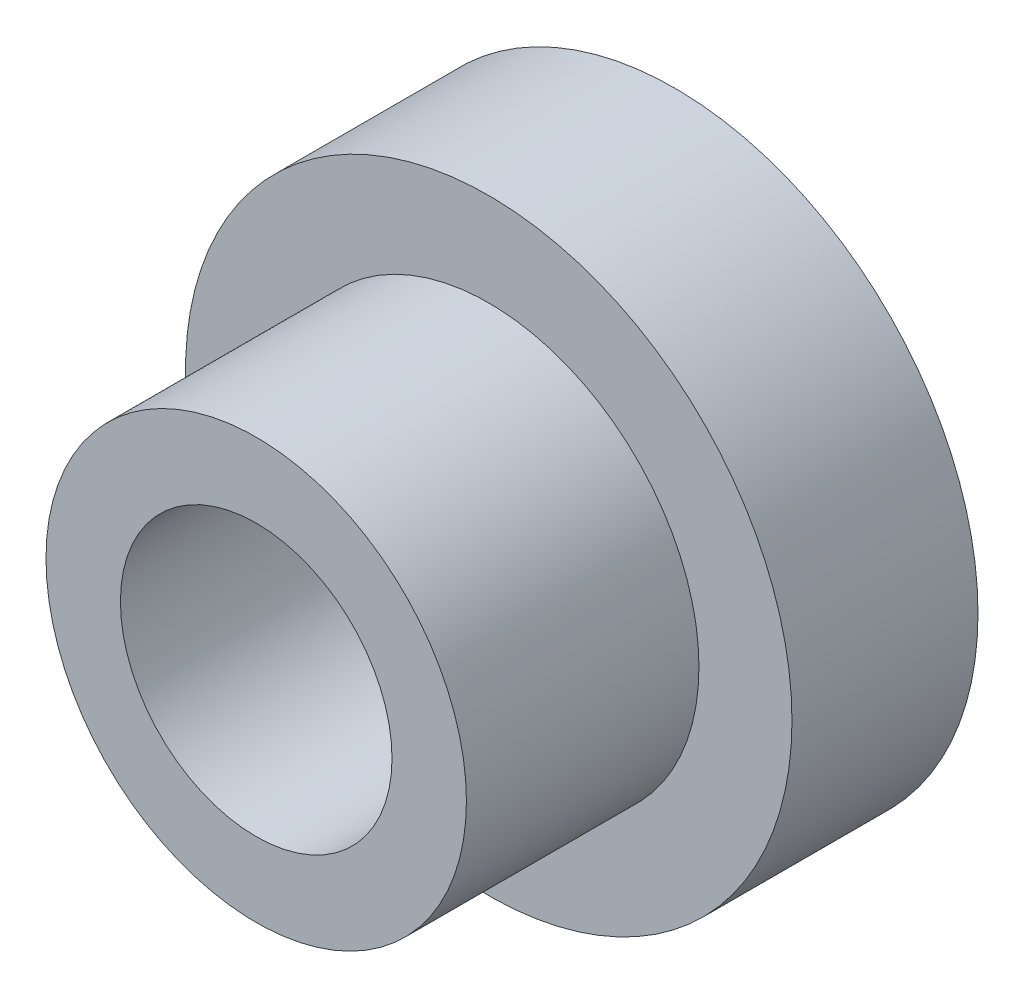
ISO-10303-21;
HEADER;
FILE_DESCRIPTION(('STEP AP214'),'2;1');
FILE_NAME('part.step','',(''),(''),'','','');
FILE_SCHEMA(('AUTOMOTIVE_DESIGN { 1 0 10303 214 1 1 1 1 }'));
ENDSEC;
DATA;
#1=APPLICATION_CONTEXT('core data for automotive mechanical design processes');
#2=APPLICATION_PROTOCOL_DEFINITION('international standard','automotive_design',2000,#1);
#3=PRODUCT_CONTEXT('',#1,'mechanical');
#4=PRODUCT('Part','Part','',(#3));
#5=PRODUCT_RELATED_PRODUCT_CATEGORY('part','',(#4));
#6=PRODUCT_DEFINITION_FORMATION('','',#4);
#7=PRODUCT_DEFINITION_CONTEXT('part definition',#1,'design');
#8=PRODUCT_DEFINITION('design','',#6,#7);
#9=PRODUCT_DEFINITION_SHAPE('','',#8);
#10=(LENGTH_UNIT() NAMED_UNIT(*) SI_UNIT(.MILLI.,.METRE.));
#11=(NAMED_UNIT(*) PLANE_ANGLE_UNIT() SI_UNIT($,.RADIAN.));
#12=(NAMED_UNIT(*) SI_UNIT($,.STERADIAN.) SOLID_ANGLE_UNIT());
#13=UNCERTAINTY_MEASURE_WITH_UNIT(LENGTH_MEASURE(1.E-05),#10,'distance_accuracy_value','');
#14=(GEOMETRIC_REPRESENTATION_CONTEXT(3) GLOBAL_UNCERTAINTY_ASSIGNED_CONTEXT((#13)) GLOBAL_UNIT_ASSIGNED_CONTEXT((#10,
#11,#12)) REPRESENTATION_CONTEXT('',''));
#15=CARTESIAN_POINT('',(0.,0.,0.));
#16=DIRECTION('',(0.,0.,1.));
#17=DIRECTION('',(1.,0.,0.));
#18=AXIS2_PLACEMENT_3D('',#15,#16,#17);
#19=CARTESIAN_POINT('',(0.,0.,17.5));
#20=DIRECTION('',(0.,0.,-1.));
#21=DIRECTION('',(-1.,0.,0.));
#22=AXIS2_PLACEMENT_3D('',#19,#20,#21);
#23=CYLINDRICAL_SURFACE('',#22,7.3);
#24=CARTESIAN_POINT('',(0.,0.,17.5));
#25=DIRECTION('',(0.,0.,1.));
#26=DIRECTION('',(1.,0.,0.));
#27=AXIS2_PLACEMENT_3D('',#24,#25,#26);
#28=CIRCLE('',#27,7.3);
#29=CARTESIAN_POINT('',(7.3,0.,17.5));
#30=VERTEX_POINT('',#29);
#31=EDGE_CURVE('E46',#30,#30,#28,.T.);
#32=ORIENTED_EDGE('',*,*,#31,.T.);
#33=EDGE_LOOP('',(#32));
#34=FACE_BOUND('',#33,.T.);
#35=CARTESIAN_POINT('',(0.,0.,0.));
#36=DIRECTION('',(0.,0.,1.));
#37=DIRECTION('',(1.,0.,0.));
#38=AXIS2_PLACEMENT_3D('',#35,#36,#37);
#39=CIRCLE('',#38,7.3);
#40=CARTESIAN_POINT('',(7.3,0.,0.));
#41=VERTEX_POINT('',#40);
#42=EDGE_CURVE('E53',#41,#41,#39,.T.);
#43=ORIENTED_EDGE('',*,*,#42,.F.);
#44=EDGE_LOOP('',(#43));
#45=FACE_BOUND('',#44,.T.);
#46=ADVANCED_FACE('F39',(#34,#45),#23,.F.);
#47=CARTESIAN_POINT('',(0.,0.,17.5));
#48=DIRECTION('',(0.,0.,-1.));
#49=DIRECTION('',(-1.,0.,0.));
#50=AXIS2_PLACEMENT_3D('',#47,#48,#49);
#51=CYLINDRICAL_SURFACE('',#50,11.3);
#52=CARTESIAN_POINT('',(0.,0.,5.));
#53=DIRECTION('',(0.,0.,1.));
#54=DIRECTION('',(1.,0.,0.));
#55=AXIS2_PLACEMENT_3D('',#52,#53,#54);
#56=CIRCLE('',#55,11.3);
#57=CARTESIAN_POINT('',(11.3,0.,5.));
#58=VERTEX_POINT('',#57);
#59=EDGE_CURVE('E68',#58,#58,#56,.T.);
#60=ORIENTED_EDGE('',*,*,#59,.T.);
#61=EDGE_LOOP('',(#60));
#62=FACE_BOUND('',#61,.T.);
#63=CARTESIAN_POINT('',(0.,0.,17.5));
#64=DIRECTION('',(0.,0.,1.));
#65=DIRECTION('',(1.,0.,0.));
#66=AXIS2_PLACEMENT_3D('',#63,#64,#65);
#67=CIRCLE('',#66,11.3);
#68=CARTESIAN_POINT('',(11.3,0.,17.5));
#69=VERTEX_POINT('',#68);
#70=EDGE_CURVE('E10',#69,#69,#67,.T.);
#71=ORIENTED_EDGE('',*,*,#70,.F.);
#72=EDGE_LOOP('',(#71));
#73=FACE_BOUND('',#72,.T.);
#74=ADVANCED_FACE('F91',(#62,#73),#51,.T.);
#75=CARTESIAN_POINT('',(0.,0.,17.5));
#76=DIRECTION('',(0.,0.,1.));
#77=DIRECTION('',(1.,0.,0.));
#78=AXIS2_PLACEMENT_3D('',#75,#76,#77);
#79=PLANE('',#78);
#80=ORIENTED_EDGE('',*,*,#31,.F.);
#81=EDGE_LOOP('',(#80));
#82=FACE_BOUND('',#81,.T.);
#83=ORIENTED_EDGE('',*,*,#70,.T.);
#84=EDGE_LOOP('',(#83));
#85=FACE_BOUND('',#84,.T.);
#86=ADVANCED_FACE('F97',(#82,#85),#79,.T.);
#87=CARTESIAN_POINT('',(0.,0.,0.));
#88=DIRECTION('',(0.,0.,1.));
#89=DIRECTION('',(1.,0.,0.));
#90=AXIS2_PLACEMENT_3D('',#87,#88,#89);
#91=PLANE('',#90);
#92=ORIENTED_EDGE('',*,*,#42,.T.);
#93=EDGE_LOOP('',(#92));
#94=FACE_BOUND('',#93,.T.);
#95=CARTESIAN_POINT('',(0.,0.,0.));
#96=DIRECTION('',(0.,0.,1.));
#97=DIRECTION('',(1.,0.,0.));
#98=AXIS2_PLACEMENT_3D('',#95,#96,#97);
#99=CIRCLE('',#98,11.3);
#100=CARTESIAN_POINT('',(11.3,0.,0.));
#101=VERTEX_POINT('',#100);
#102=EDGE_CURVE('E42',#101,#101,#99,.T.);
#103=ORIENTED_EDGE('',*,*,#102,.F.);
#104=EDGE_LOOP('',(#103));
#105=FACE_BOUND('',#104,.T.);
#106=ADVANCED_FACE('F86',(#94,#105),#91,.F.);
#107=CARTESIAN_POINT('',(0.,0.,-5.));
#108=DIRECTION('',(0.,0.,1.));
#109=DIRECTION('',(1.,0.,0.));
#110=AXIS2_PLACEMENT_3D('',#107,#108,#109);
#111=CYLINDRICAL_SURFACE('',#110,11.3);
#112=CARTESIAN_POINT('',(0.,0.,-5.));
#113=DIRECTION('',(0.,0.,1.));
#114=DIRECTION('',(1.,0.,0.));
#115=AXIS2_PLACEMENT_3D('',#112,#113,#114);
#116=CIRCLE('',#115,11.3);
#117=CARTESIAN_POINT('',(11.3,0.,-5.));
#118=VERTEX_POINT('',#117);
#119=EDGE_CURVE('E60',#118,#118,#116,.T.);
#120=ORIENTED_EDGE('',*,*,#119,.F.);
#121=EDGE_LOOP('',(#120));
#122=FACE_BOUND('',#121,.T.);
#123=ORIENTED_EDGE('',*,*,#102,.T.);
#124=EDGE_LOOP('',(#123));
#125=FACE_BOUND('',#124,.T.);
#126=ADVANCED_FACE('F78',(#122,#125),#111,.F.);
#127=CARTESIAN_POINT('',(0.,0.,-5.));
#128=DIRECTION('',(0.,0.,1.));
#129=DIRECTION('',(1.,0.,0.));
#130=AXIS2_PLACEMENT_3D('',#127,#128,#129);
#131=CYLINDRICAL_SURFACE('',#130,16.3);
#132=CARTESIAN_POINT('',(0.,0.,-5.));
#133=DIRECTION('',(0.,0.,1.));
#134=DIRECTION('',(1.,0.,0.));
#135=AXIS2_PLACEMENT_3D('',#132,#133,#134);
#136=CIRCLE('',#135,16.3);
#137=CARTESIAN_POINT('',(16.3,0.,-5.));
#138=VERTEX_POINT('',#137);
#139=EDGE_CURVE('E55',#138,#138,#136,.T.);
#140=ORIENTED_EDGE('',*,*,#139,.T.);
#141=EDGE_LOOP('',(#140));
#142=FACE_BOUND('',#141,.T.);
#143=CARTESIAN_POINT('',(0.,0.,5.));
#144=DIRECTION('',(0.,0.,1.));
#145=DIRECTION('',(1.,0.,0.));
#146=AXIS2_PLACEMENT_3D('',#143,#144,#145);
#147=CIRCLE('',#146,16.3);
#148=CARTESIAN_POINT('',(16.3,0.,5.));
#149=VERTEX_POINT('',#148);
#150=EDGE_CURVE('E65',#149,#149,#147,.T.);
#151=ORIENTED_EDGE('',*,*,#150,.F.);
#152=EDGE_LOOP('',(#151));
#153=FACE_BOUND('',#152,.T.);
#154=ADVANCED_FACE('F75',(#142,#153),#131,.T.);
#155=CARTESIAN_POINT('',(0.,0.,-5.));
#156=DIRECTION('',(0.,0.,1.));
#157=DIRECTION('',(1.,0.,0.));
#158=AXIS2_PLACEMENT_3D('',#155,#156,#157);
#159=PLANE('',#158);
#160=ORIENTED_EDGE('',*,*,#119,.T.);
#161=EDGE_LOOP('',(#160));
#162=FACE_BOUND('',#161,.T.);
#163=ORIENTED_EDGE('',*,*,#139,.F.);
#164=EDGE_LOOP('',(#163));
#165=FACE_BOUND('',#164,.T.);
#166=ADVANCED_FACE('F77',(#162,#165),#159,.F.);
#167=CARTESIAN_POINT('',(0.,0.,5.));
#168=DIRECTION('',(0.,0.,1.));
#169=DIRECTION('',(1.,0.,0.));
#170=AXIS2_PLACEMENT_3D('',#167,#168,#169);
#171=PLANE('',#170);
#172=ORIENTED_EDGE('',*,*,#59,.F.);
#173=EDGE_LOOP('',(#172));
#174=FACE_BOUND('',#173,.T.);
#175=ORIENTED_EDGE('',*,*,#150,.T.);
#176=EDGE_LOOP('',(#175));
#177=FACE_BOUND('',#176,.T.);
#178=ADVANCED_FACE('F73',(#174,#177),#171,.T.);
#179=CLOSED_SHELL('',(#46,#74,#86,#106,#126,#154,#166,#178));
#180=MANIFOLD_SOLID_BREP('B2',#179);
#181=ADVANCED_BREP_SHAPE_REPRESENTATION('',(#18,#180),#14);
#182=SHAPE_DEFINITION_REPRESENTATION(#9,#181);
ENDSEC;
END-ISO-10303-21;
